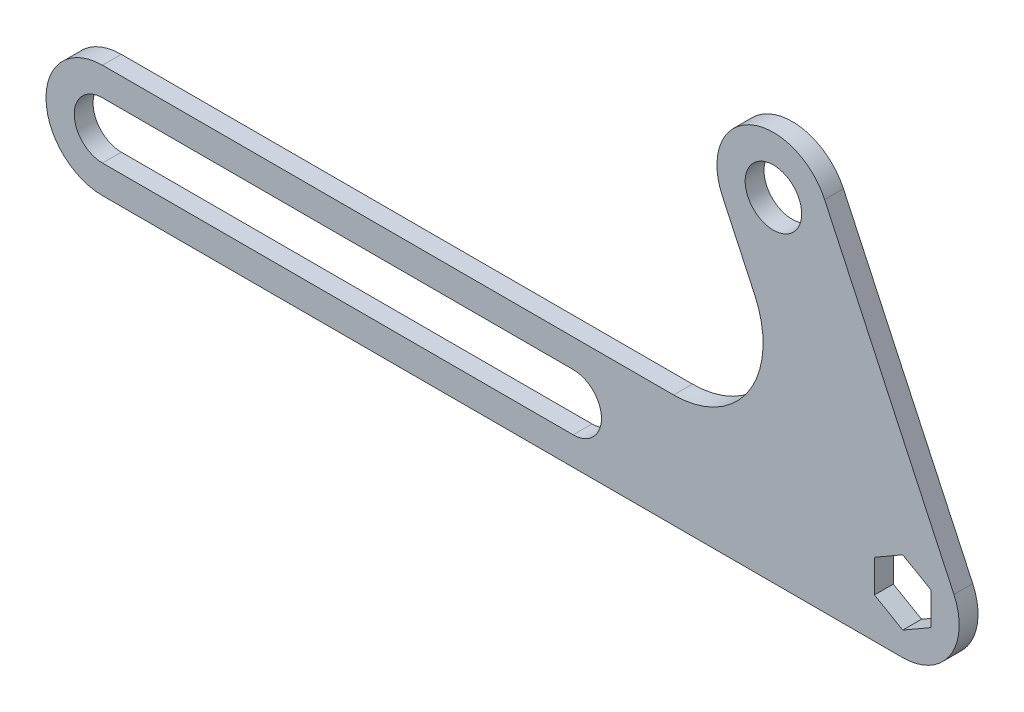
ISO-10303-21;
HEADER;
FILE_DESCRIPTION(('STEP AP214'),'2;1');
FILE_NAME('part.step','',(''),(''),'','','');
FILE_SCHEMA(('AUTOMOTIVE_DESIGN { 1 0 10303 214 1 1 1 1 }'));
ENDSEC;
DATA;
#1=APPLICATION_CONTEXT('core data for automotive mechanical design processes');
#2=APPLICATION_PROTOCOL_DEFINITION('international standard','automotive_design',2000,#1);
#3=PRODUCT_CONTEXT('',#1,'mechanical');
#4=PRODUCT('Part','Part','',(#3));
#5=PRODUCT_RELATED_PRODUCT_CATEGORY('part','',(#4));
#6=PRODUCT_DEFINITION_FORMATION('','',#4);
#7=PRODUCT_DEFINITION_CONTEXT('part definition',#1,'design');
#8=PRODUCT_DEFINITION('design','',#6,#7);
#9=PRODUCT_DEFINITION_SHAPE('','',#8);
#10=(LENGTH_UNIT() NAMED_UNIT(*) SI_UNIT(.MILLI.,.METRE.));
#11=(NAMED_UNIT(*) PLANE_ANGLE_UNIT() SI_UNIT($,.RADIAN.));
#12=(NAMED_UNIT(*) SI_UNIT($,.STERADIAN.) SOLID_ANGLE_UNIT());
#13=UNCERTAINTY_MEASURE_WITH_UNIT(LENGTH_MEASURE(1.E-05),#10,'distance_accuracy_value','');
#14=(GEOMETRIC_REPRESENTATION_CONTEXT(3) GLOBAL_UNCERTAINTY_ASSIGNED_CONTEXT((#13)) GLOBAL_UNIT_ASSIGNED_CONTEXT((#10,
#11,#12)) REPRESENTATION_CONTEXT('',''));
#15=CARTESIAN_POINT('',(0.,0.,0.));
#16=DIRECTION('',(0.,0.,1.));
#17=DIRECTION('',(1.,0.,0.));
#18=AXIS2_PLACEMENT_3D('',#15,#16,#17);
#19=CARTESIAN_POINT('',(0.,12.,4.));
#20=DIRECTION('',(0.,0.,1.));
#21=DIRECTION('',(1.,0.,0.));
#22=AXIS2_PLACEMENT_3D('',#19,#20,#21);
#23=PLANE('',#22);
#24=DIRECTION('',(1.,0.,0.));
#25=VECTOR('',#24,1.);
#26=CARTESIAN_POINT('',(0.,6.,4.));
#27=LINE('',#26,#25);
#28=CARTESIAN_POINT('',(0.,6.,4.));
#29=VERTEX_POINT('',#28);
#30=CARTESIAN_POINT('',(100.,6.,4.));
#31=VERTEX_POINT('',#30);
#32=EDGE_CURVE('E245',#29,#31,#27,.T.);
#33=ORIENTED_EDGE('',*,*,#32,.F.);
#34=CARTESIAN_POINT('',(0.,12.,4.));
#35=DIRECTION('',(0.,0.,1.));
#36=DIRECTION('',(1.,0.,0.));
#37=AXIS2_PLACEMENT_3D('',#34,#35,#36);
#38=CIRCLE('',#37,6.);
#39=CARTESIAN_POINT('',(0.,18.,4.));
#40=VERTEX_POINT('',#39);
#41=EDGE_CURVE('E242',#40,#29,#38,.T.);
#42=ORIENTED_EDGE('',*,*,#41,.F.);
#43=DIRECTION('',(-1.,0.,0.));
#44=VECTOR('',#43,1.);
#45=CARTESIAN_POINT('',(0.,18.,4.));
#46=LINE('',#45,#44);
#47=CARTESIAN_POINT('',(100.,18.,4.));
#48=VERTEX_POINT('',#47);
#49=EDGE_CURVE('E253',#48,#40,#46,.T.);
#50=ORIENTED_EDGE('',*,*,#49,.F.);
#51=CARTESIAN_POINT('',(100.,12.,4.));
#52=DIRECTION('',(0.,0.,1.));
#53=DIRECTION('',(1.,0.,0.));
#54=AXIS2_PLACEMENT_3D('',#51,#52,#53);
#55=CIRCLE('',#54,6.);
#56=EDGE_CURVE('E249',#31,#48,#55,.T.);
#57=ORIENTED_EDGE('',*,*,#56,.F.);
#58=EDGE_LOOP('',(#33,#42,#50,#57));
#59=FACE_BOUND('',#58,.T.);
#60=CARTESIAN_POINT('',(0.,12.,4.));
#61=DIRECTION('',(0.,0.,1.));
#62=DIRECTION('',(1.,0.,0.));
#63=AXIS2_PLACEMENT_3D('',#60,#61,#62);
#64=CIRCLE('',#63,12.);
#65=CARTESIAN_POINT('',(0.,24.,4.));
#66=VERTEX_POINT('',#65);
#67=CARTESIAN_POINT('',(0.,0.,4.));
#68=VERTEX_POINT('',#67);
#69=EDGE_CURVE('E285',#66,#68,#64,.T.);
#70=ORIENTED_EDGE('',*,*,#69,.T.);
#71=DIRECTION('',(1.,0.,0.));
#72=VECTOR('',#71,1.);
#73=CARTESIAN_POINT('',(0.,0.,4.));
#74=LINE('',#73,#72);
#75=CARTESIAN_POINT('',(170.,0.,4.));
#76=VERTEX_POINT('',#75);
#77=EDGE_CURVE('E289',#68,#76,#74,.T.);
#78=ORIENTED_EDGE('',*,*,#77,.T.);
#79=CARTESIAN_POINT('',(170.,12.,4.));
#80=DIRECTION('',(0.,0.,1.));
#81=DIRECTION('',(1.,0.,0.));
#82=AXIS2_PLACEMENT_3D('',#79,#80,#81);
#83=CIRCLE('',#82,12.);
#84=CARTESIAN_POINT('',(180.87569344444,17.0714191408884,4.));
#85=VERTEX_POINT('',#84);
#86=EDGE_CURVE('E293',#76,#85,#83,.T.);
#87=ORIENTED_EDGE('',*,*,#86,.T.);
#88=DIRECTION('',(-0.422618261740704,0.906307787036648,0.));
#89=VECTOR('',#88,1.);
#90=CARTESIAN_POINT('',(180.87569344444,17.0714191408884,4.));
#91=LINE('',#90,#89);
#92=CARTESIAN_POINT('',(153.405506431294,75.9814252982705,4.));
#93=VERTEX_POINT('',#92);
#94=EDGE_CURVE('E296',#85,#93,#91,.T.);
#95=ORIENTED_EDGE('',*,*,#94,.T.);
#96=CARTESIAN_POINT('',(142.529812986854,70.9100061573821,4.));
#97=DIRECTION('',(0.,0.,1.));
#98=DIRECTION('',(1.,0.,0.));
#99=AXIS2_PLACEMENT_3D('',#96,#97,#98);
#100=CIRCLE('',#99,12.);
#101=CARTESIAN_POINT('',(131.654119542414,65.8385870164936,4.));
#102=VERTEX_POINT('',#101);
#103=EDGE_CURVE('E299',#93,#102,#100,.T.);
#104=ORIENTED_EDGE('',*,*,#103,.T.);
#105=DIRECTION('',(0.422618261740704,-0.906307787036648,0.));
#106=VECTOR('',#105,1.);
#107=CARTESIAN_POINT('',(131.654119542414,65.8385870164936,4.));
#108=LINE('',#107,#106);
#109=CARTESIAN_POINT('',(138.559595063054,51.0297469730734,4.));
#110=VERTEX_POINT('',#109);
#111=EDGE_CURVE('E302',#102,#110,#108,.T.);
#112=ORIENTED_EDGE('',*,*,#111,.T.);
#113=CARTESIAN_POINT('',(121.339747109357,43.,4.));
#114=DIRECTION('',(0.,0.,-1.));
#115=DIRECTION('',(-1.,0.,0.));
#116=AXIS2_PLACEMENT_3D('',#113,#114,#115);
#117=CIRCLE('',#116,19.);
#118=CARTESIAN_POINT('',(121.339747109357,24.,4.));
#119=VERTEX_POINT('',#118);
#120=EDGE_CURVE('E305',#110,#119,#117,.T.);
#121=ORIENTED_EDGE('',*,*,#120,.T.);
#122=DIRECTION('',(-1.,0.,0.));
#123=VECTOR('',#122,1.);
#124=CARTESIAN_POINT('',(121.339747109357,24.,4.));
#125=LINE('',#124,#123);
#126=EDGE_CURVE('E308',#119,#66,#125,.T.);
#127=ORIENTED_EDGE('',*,*,#126,.T.);
#128=EDGE_LOOP('',(#70,#78,#87,#95,#104,#112,#121,#127));
#129=FACE_BOUND('',#128,.T.);
#130=CARTESIAN_POINT('',(142.529812986854,70.9100061573821,4.));
#131=DIRECTION('',(0.,0.,1.));
#132=DIRECTION('',(1.,0.,0.));
#133=AXIS2_PLACEMENT_3D('',#130,#131,#132);
#134=CIRCLE('',#133,6.00000000000002);
#135=CARTESIAN_POINT('',(148.529812986854,70.9100061573821,4.));
#136=VERTEX_POINT('',#135);
#137=EDGE_CURVE('E234',#136,#136,#134,.T.);
#138=ORIENTED_EDGE('',*,*,#137,.F.);
#139=EDGE_LOOP('',(#138));
#140=FACE_BOUND('',#139,.T.);
#141=DIRECTION('',(-0.866025403784437,-0.500000000000002,0.));
#142=VECTOR('',#141,1.);
#143=CARTESIAN_POINT('',(170.,18.9282032302755,4.));
#144=LINE('',#143,#142);
#145=CARTESIAN_POINT('',(170.,18.9282032302755,4.));
#146=VERTEX_POINT('',#145);
#147=CARTESIAN_POINT('',(164.,15.4641016151377,4.));
#148=VERTEX_POINT('',#147);
#149=EDGE_CURVE('E174',#146,#148,#144,.T.);
#150=ORIENTED_EDGE('',*,*,#149,.F.);
#151=DIRECTION('',(-0.866025403784439,0.499999999999999,0.));
#152=VECTOR('',#151,1.);
#153=CARTESIAN_POINT('',(176.,15.4641016151377,4.));
#154=LINE('',#153,#152);
#155=CARTESIAN_POINT('',(176.,15.4641016151377,4.));
#156=VERTEX_POINT('',#155);
#157=EDGE_CURVE('E165',#156,#146,#154,.T.);
#158=ORIENTED_EDGE('',*,*,#157,.F.);
#159=DIRECTION('',(0.,1.,0.));
#160=VECTOR('',#159,1.);
#161=CARTESIAN_POINT('',(176.,8.53589838486226,4.));
#162=LINE('',#161,#160);
#163=CARTESIAN_POINT('',(176.,8.53589838486226,4.));
#164=VERTEX_POINT('',#163);
#165=EDGE_CURVE('E200',#164,#156,#162,.T.);
#166=ORIENTED_EDGE('',*,*,#165,.F.);
#167=DIRECTION('',(0.866025403784439,0.499999999999999,0.));
#168=VECTOR('',#167,1.);
#169=CARTESIAN_POINT('',(170.,5.07179676972451,4.));
#170=LINE('',#169,#168);
#171=CARTESIAN_POINT('',(170.,5.07179676972451,4.));
#172=VERTEX_POINT('',#171);
#173=EDGE_CURVE('E197',#172,#164,#170,.T.);
#174=ORIENTED_EDGE('',*,*,#173,.F.);
#175=DIRECTION('',(0.866025403784438,-0.500000000000001,0.));
#176=VECTOR('',#175,1.);
#177=CARTESIAN_POINT('',(164.,8.53589838486224,4.));
#178=LINE('',#177,#176);
#179=CARTESIAN_POINT('',(164.,8.53589838486224,4.));
#180=VERTEX_POINT('',#179);
#181=EDGE_CURVE('E192',#180,#172,#178,.T.);
#182=ORIENTED_EDGE('',*,*,#181,.F.);
#183=DIRECTION('',(0.,-1.,0.));
#184=VECTOR('',#183,1.);
#185=CARTESIAN_POINT('',(164.,15.4641016151377,4.));
#186=LINE('',#185,#184);
#187=EDGE_CURVE('E188',#148,#180,#186,.T.);
#188=ORIENTED_EDGE('',*,*,#187,.F.);
#189=EDGE_LOOP('',(#150,#158,#166,#174,#182,#188));
#190=FACE_BOUND('',#189,.T.);
#191=ADVANCED_FACE('F39',(#59,#129,#140,#190),#23,.T.);
#192=CARTESIAN_POINT('',(0.,12.,0.));
#193=DIRECTION('',(0.,0.,1.));
#194=DIRECTION('',(1.,0.,0.));
#195=AXIS2_PLACEMENT_3D('',#192,#193,#194);
#196=PLANE('',#195);
#197=CARTESIAN_POINT('',(142.529812986854,70.9100061573821,0.));
#198=DIRECTION('',(0.,0.,1.));
#199=DIRECTION('',(1.,0.,0.));
#200=AXIS2_PLACEMENT_3D('',#197,#198,#199);
#201=CIRCLE('',#200,6.00000000000002);
#202=CARTESIAN_POINT('',(148.529812986854,70.9100061573821,0.));
#203=VERTEX_POINT('',#202);
#204=EDGE_CURVE('E183',#203,#203,#201,.T.);
#205=ORIENTED_EDGE('',*,*,#204,.T.);
#206=EDGE_LOOP('',(#205));
#207=FACE_BOUND('',#206,.T.);
#208=CARTESIAN_POINT('',(0.,12.,0.));
#209=DIRECTION('',(0.,0.,1.));
#210=DIRECTION('',(1.,0.,0.));
#211=AXIS2_PLACEMENT_3D('',#208,#209,#210);
#212=CIRCLE('',#211,6.);
#213=CARTESIAN_POINT('',(0.,18.,0.));
#214=VERTEX_POINT('',#213);
#215=CARTESIAN_POINT('',(0.,6.,0.));
#216=VERTEX_POINT('',#215);
#217=EDGE_CURVE('E238',#214,#216,#212,.T.);
#218=ORIENTED_EDGE('',*,*,#217,.T.);
#219=DIRECTION('',(1.,0.,0.));
#220=VECTOR('',#219,1.);
#221=CARTESIAN_POINT('',(0.,6.,0.));
#222=LINE('',#221,#220);
#223=CARTESIAN_POINT('',(100.,6.,0.));
#224=VERTEX_POINT('',#223);
#225=EDGE_CURVE('E260',#216,#224,#222,.T.);
#226=ORIENTED_EDGE('',*,*,#225,.T.);
#227=CARTESIAN_POINT('',(100.,12.,0.));
#228=DIRECTION('',(0.,0.,1.));
#229=DIRECTION('',(1.,0.,0.));
#230=AXIS2_PLACEMENT_3D('',#227,#228,#229);
#231=CIRCLE('',#230,6.);
#232=CARTESIAN_POINT('',(100.,18.,0.));
#233=VERTEX_POINT('',#232);
#234=EDGE_CURVE('E264',#224,#233,#231,.T.);
#235=ORIENTED_EDGE('',*,*,#234,.T.);
#236=DIRECTION('',(-1.,0.,0.));
#237=VECTOR('',#236,1.);
#238=CARTESIAN_POINT('',(0.,18.,0.));
#239=LINE('',#238,#237);
#240=EDGE_CURVE('E246',#233,#214,#239,.T.);
#241=ORIENTED_EDGE('',*,*,#240,.T.);
#242=EDGE_LOOP('',(#218,#226,#235,#241));
#243=FACE_BOUND('',#242,.T.);
#244=CARTESIAN_POINT('',(0.,12.,0.));
#245=DIRECTION('',(0.,0.,1.));
#246=DIRECTION('',(1.,0.,0.));
#247=AXIS2_PLACEMENT_3D('',#244,#245,#246);
#248=CIRCLE('',#247,12.);
#249=CARTESIAN_POINT('',(0.,24.,0.));
#250=VERTEX_POINT('',#249);
#251=CARTESIAN_POINT('',(0.,0.,0.));
#252=VERTEX_POINT('',#251);
#253=EDGE_CURVE('E284',#250,#252,#248,.T.);
#254=ORIENTED_EDGE('',*,*,#253,.F.);
#255=DIRECTION('',(-1.,0.,0.));
#256=VECTOR('',#255,1.);
#257=CARTESIAN_POINT('',(121.339747109357,24.,0.));
#258=LINE('',#257,#256);
#259=CARTESIAN_POINT('',(121.339747109357,24.,0.));
#260=VERTEX_POINT('',#259);
#261=EDGE_CURVE('E290',#260,#250,#258,.T.);
#262=ORIENTED_EDGE('',*,*,#261,.F.);
#263=CARTESIAN_POINT('',(121.339747109357,43.,0.));
#264=DIRECTION('',(0.,0.,-1.));
#265=DIRECTION('',(-1.,0.,0.));
#266=AXIS2_PLACEMENT_3D('',#263,#264,#265);
#267=CIRCLE('',#266,19.);
#268=CARTESIAN_POINT('',(138.559595063054,51.0297469730734,0.));
#269=VERTEX_POINT('',#268);
#270=EDGE_CURVE('E330',#269,#260,#267,.T.);
#271=ORIENTED_EDGE('',*,*,#270,.F.);
#272=DIRECTION('',(0.422618261740704,-0.906307787036648,0.));
#273=VECTOR('',#272,1.);
#274=CARTESIAN_POINT('',(131.654119542414,65.8385870164936,0.));
#275=LINE('',#274,#273);
#276=CARTESIAN_POINT('',(131.654119542414,65.8385870164936,0.));
#277=VERTEX_POINT('',#276);
#278=EDGE_CURVE('E327',#277,#269,#275,.T.);
#279=ORIENTED_EDGE('',*,*,#278,.F.);
#280=CARTESIAN_POINT('',(142.529812986854,70.9100061573821,0.));
#281=DIRECTION('',(0.,0.,1.));
#282=DIRECTION('',(1.,0.,0.));
#283=AXIS2_PLACEMENT_3D('',#280,#281,#282);
#284=CIRCLE('',#283,12.);
#285=CARTESIAN_POINT('',(153.405506431294,75.9814252982705,0.));
#286=VERTEX_POINT('',#285);
#287=EDGE_CURVE('E324',#286,#277,#284,.T.);
#288=ORIENTED_EDGE('',*,*,#287,.F.);
#289=DIRECTION('',(-0.422618261740704,0.906307787036648,0.));
#290=VECTOR('',#289,1.);
#291=CARTESIAN_POINT('',(180.87569344444,17.0714191408884,0.));
#292=LINE('',#291,#290);
#293=CARTESIAN_POINT('',(180.87569344444,17.0714191408884,0.));
#294=VERTEX_POINT('',#293);
#295=EDGE_CURVE('E321',#294,#286,#292,.T.);
#296=ORIENTED_EDGE('',*,*,#295,.F.);
#297=CARTESIAN_POINT('',(170.,12.,0.));
#298=DIRECTION('',(0.,0.,1.));
#299=DIRECTION('',(1.,0.,0.));
#300=AXIS2_PLACEMENT_3D('',#297,#298,#299);
#301=CIRCLE('',#300,12.);
#302=CARTESIAN_POINT('',(170.,0.,0.));
#303=VERTEX_POINT('',#302);
#304=EDGE_CURVE('E318',#303,#294,#301,.T.);
#305=ORIENTED_EDGE('',*,*,#304,.F.);
#306=DIRECTION('',(1.,0.,0.));
#307=VECTOR('',#306,1.);
#308=CARTESIAN_POINT('',(0.,0.,0.));
#309=LINE('',#308,#307);
#310=EDGE_CURVE('E315',#252,#303,#309,.T.);
#311=ORIENTED_EDGE('',*,*,#310,.F.);
#312=EDGE_LOOP('',(#254,#262,#271,#279,#288,#296,#305,#311));
#313=FACE_BOUND('',#312,.T.);
#314=DIRECTION('',(-0.866025403784439,0.499999999999999,0.));
#315=VECTOR('',#314,1.);
#316=CARTESIAN_POINT('',(176.,15.4641016151377,0.));
#317=LINE('',#316,#315);
#318=CARTESIAN_POINT('',(176.,15.4641016151377,0.));
#319=VERTEX_POINT('',#318);
#320=CARTESIAN_POINT('',(170.,18.9282032302755,0.));
#321=VERTEX_POINT('',#320);
#322=EDGE_CURVE('E63',#319,#321,#317,.T.);
#323=ORIENTED_EDGE('',*,*,#322,.T.);
#324=DIRECTION('',(-0.866025403784437,-0.500000000000002,0.));
#325=VECTOR('',#324,1.);
#326=CARTESIAN_POINT('',(170.,18.9282032302755,0.));
#327=LINE('',#326,#325);
#328=CARTESIAN_POINT('',(164.,15.4641016151377,0.));
#329=VERTEX_POINT('',#328);
#330=EDGE_CURVE('E181',#321,#329,#327,.T.);
#331=ORIENTED_EDGE('',*,*,#330,.T.);
#332=DIRECTION('',(0.,-1.,0.));
#333=VECTOR('',#332,1.);
#334=CARTESIAN_POINT('',(164.,15.4641016151377,0.));
#335=LINE('',#334,#333);
#336=CARTESIAN_POINT('',(164.,8.53589838486224,0.));
#337=VERTEX_POINT('',#336);
#338=EDGE_CURVE('E207',#329,#337,#335,.T.);
#339=ORIENTED_EDGE('',*,*,#338,.T.);
#340=DIRECTION('',(0.866025403784438,-0.500000000000001,0.));
#341=VECTOR('',#340,1.);
#342=CARTESIAN_POINT('',(164.,8.53589838486224,0.));
#343=LINE('',#342,#341);
#344=CARTESIAN_POINT('',(170.,5.07179676972451,0.));
#345=VERTEX_POINT('',#344);
#346=EDGE_CURVE('E211',#337,#345,#343,.T.);
#347=ORIENTED_EDGE('',*,*,#346,.T.);
#348=DIRECTION('',(0.866025403784439,0.499999999999999,0.));
#349=VECTOR('',#348,1.);
#350=CARTESIAN_POINT('',(170.,5.07179676972451,0.));
#351=LINE('',#350,#349);
#352=CARTESIAN_POINT('',(176.,8.53589838486226,0.));
#353=VERTEX_POINT('',#352);
#354=EDGE_CURVE('E215',#345,#353,#351,.T.);
#355=ORIENTED_EDGE('',*,*,#354,.T.);
#356=DIRECTION('',(0.,1.,0.));
#357=VECTOR('',#356,1.);
#358=CARTESIAN_POINT('',(176.,8.53589838486226,0.));
#359=LINE('',#358,#357);
#360=EDGE_CURVE('E175',#353,#319,#359,.T.);
#361=ORIENTED_EDGE('',*,*,#360,.T.);
#362=EDGE_LOOP('',(#323,#331,#339,#347,#355,#361));
#363=FACE_BOUND('',#362,.T.);
#364=ADVANCED_FACE('F369',(#207,#243,#313,#363),#196,.F.);
#365=CARTESIAN_POINT('',(0.,12.,4.));
#366=DIRECTION('',(0.,0.,-1.));
#367=DIRECTION('',(-1.,0.,0.));
#368=AXIS2_PLACEMENT_3D('',#365,#366,#367);
#369=CYLINDRICAL_SURFACE('',#368,12.);
#370=ORIENTED_EDGE('',*,*,#253,.T.);
#371=DIRECTION('',(0.,0.,-1.));
#372=VECTOR('',#371,1.);
#373=CARTESIAN_POINT('',(0.,0.,4.));
#374=LINE('',#373,#372);
#375=EDGE_CURVE('E11',#68,#252,#374,.T.);
#376=ORIENTED_EDGE('',*,*,#375,.F.);
#377=ORIENTED_EDGE('',*,*,#69,.F.);
#378=DIRECTION('',(0.,0.,-1.));
#379=VECTOR('',#378,1.);
#380=CARTESIAN_POINT('',(0.,24.,4.));
#381=LINE('',#380,#379);
#382=EDGE_CURVE('E311',#66,#250,#381,.T.);
#383=ORIENTED_EDGE('',*,*,#382,.T.);
#384=EDGE_LOOP('',(#370,#376,#377,#383));
#385=FACE_BOUND('',#384,.T.);
#386=ADVANCED_FACE('F41',(#385),#369,.T.);
#387=CARTESIAN_POINT('',(0.,0.,4.));
#388=DIRECTION('',(0.,1.,0.));
#389=DIRECTION('',(0.,0.,1.));
#390=AXIS2_PLACEMENT_3D('',#387,#388,#389);
#391=PLANE('',#390);
#392=ORIENTED_EDGE('',*,*,#310,.T.);
#393=DIRECTION('',(0.,0.,-1.));
#394=VECTOR('',#393,1.);
#395=CARTESIAN_POINT('',(170.,0.,4.));
#396=LINE('',#395,#394);
#397=EDGE_CURVE('E48',#76,#303,#396,.T.);
#398=ORIENTED_EDGE('',*,*,#397,.F.);
#399=ORIENTED_EDGE('',*,*,#77,.F.);
#400=ORIENTED_EDGE('',*,*,#375,.T.);
#401=EDGE_LOOP('',(#392,#398,#399,#400));
#402=FACE_BOUND('',#401,.T.);
#403=ADVANCED_FACE('F387',(#402),#391,.F.);
#404=CARTESIAN_POINT('',(170.,12.,4.));
#405=DIRECTION('',(0.,0.,-1.));
#406=DIRECTION('',(-1.,0.,0.));
#407=AXIS2_PLACEMENT_3D('',#404,#405,#406);
#408=CYLINDRICAL_SURFACE('',#407,12.);
#409=ORIENTED_EDGE('',*,*,#304,.T.);
#410=DIRECTION('',(0.,0.,-1.));
#411=VECTOR('',#410,1.);
#412=CARTESIAN_POINT('',(180.87569344444,17.0714191408884,4.));
#413=LINE('',#412,#411);
#414=EDGE_CURVE('E354',#85,#294,#413,.T.);
#415=ORIENTED_EDGE('',*,*,#414,.F.);
#416=ORIENTED_EDGE('',*,*,#86,.F.);
#417=ORIENTED_EDGE('',*,*,#397,.T.);
#418=EDGE_LOOP('',(#409,#415,#416,#417));
#419=FACE_BOUND('',#418,.T.);
#420=ADVANCED_FACE('F363',(#419),#408,.T.);
#421=CARTESIAN_POINT('',(180.87569344444,17.0714191408884,4.));
#422=DIRECTION('',(-0.906307787036648,-0.422618261740704,0.));
#423=DIRECTION('',(0.422618261740704,-0.906307787036648,0.));
#424=AXIS2_PLACEMENT_3D('',#421,#422,#423);
#425=PLANE('',#424);
#426=ORIENTED_EDGE('',*,*,#295,.T.);
#427=DIRECTION('',(0.,0.,-1.));
#428=VECTOR('',#427,1.);
#429=CARTESIAN_POINT('',(153.405506431294,75.9814252982705,4.));
#430=LINE('',#429,#428);
#431=EDGE_CURVE('E350',#93,#286,#430,.T.);
#432=ORIENTED_EDGE('',*,*,#431,.F.);
#433=ORIENTED_EDGE('',*,*,#94,.F.);
#434=ORIENTED_EDGE('',*,*,#414,.T.);
#435=EDGE_LOOP('',(#426,#432,#433,#434));
#436=FACE_BOUND('',#435,.T.);
#437=ADVANCED_FACE('F375',(#436),#425,.F.);
#438=CARTESIAN_POINT('',(142.529812986854,70.9100061573821,4.));
#439=DIRECTION('',(0.,0.,-1.));
#440=DIRECTION('',(-1.,0.,0.));
#441=AXIS2_PLACEMENT_3D('',#438,#439,#440);
#442=CYLINDRICAL_SURFACE('',#441,12.);
#443=ORIENTED_EDGE('',*,*,#287,.T.);
#444=DIRECTION('',(0.,0.,-1.));
#445=VECTOR('',#444,1.);
#446=CARTESIAN_POINT('',(131.654119542414,65.8385870164936,4.));
#447=LINE('',#446,#445);
#448=EDGE_CURVE('E346',#102,#277,#447,.T.);
#449=ORIENTED_EDGE('',*,*,#448,.F.);
#450=ORIENTED_EDGE('',*,*,#103,.F.);
#451=ORIENTED_EDGE('',*,*,#431,.T.);
#452=EDGE_LOOP('',(#443,#449,#450,#451));
#453=FACE_BOUND('',#452,.T.);
#454=ADVANCED_FACE('F379',(#453),#442,.T.);
#455=CARTESIAN_POINT('',(131.654119542414,65.8385870164936,4.));
#456=DIRECTION('',(0.906307787036648,0.422618261740704,0.));
#457=DIRECTION('',(-0.422618261740704,0.906307787036648,0.));
#458=AXIS2_PLACEMENT_3D('',#455,#456,#457);
#459=PLANE('',#458);
#460=ORIENTED_EDGE('',*,*,#278,.T.);
#461=DIRECTION('',(0.,0.,-1.));
#462=VECTOR('',#461,1.);
#463=CARTESIAN_POINT('',(138.559595063054,51.0297469730734,4.));
#464=LINE('',#463,#462);
#465=EDGE_CURVE('E342',#110,#269,#464,.T.);
#466=ORIENTED_EDGE('',*,*,#465,.F.);
#467=ORIENTED_EDGE('',*,*,#111,.F.);
#468=ORIENTED_EDGE('',*,*,#448,.T.);
#469=EDGE_LOOP('',(#460,#466,#467,#468));
#470=FACE_BOUND('',#469,.T.);
#471=ADVANCED_FACE('F400',(#470),#459,.F.);
#472=CARTESIAN_POINT('',(121.339747109357,43.,4.));
#473=DIRECTION('',(0.,0.,-1.));
#474=DIRECTION('',(-1.,0.,0.));
#475=AXIS2_PLACEMENT_3D('',#472,#473,#474);
#476=CYLINDRICAL_SURFACE('',#475,19.);
#477=ORIENTED_EDGE('',*,*,#270,.T.);
#478=DIRECTION('',(0.,0.,-1.));
#479=VECTOR('',#478,1.);
#480=CARTESIAN_POINT('',(121.339747109357,24.,4.));
#481=LINE('',#480,#479);
#482=EDGE_CURVE('E338',#119,#260,#481,.T.);
#483=ORIENTED_EDGE('',*,*,#482,.F.);
#484=ORIENTED_EDGE('',*,*,#120,.F.);
#485=ORIENTED_EDGE('',*,*,#465,.T.);
#486=EDGE_LOOP('',(#477,#483,#484,#485));
#487=FACE_BOUND('',#486,.T.);
#488=ADVANCED_FACE('F398',(#487),#476,.F.);
#489=CARTESIAN_POINT('',(121.339747109357,24.,4.));
#490=DIRECTION('',(0.,-1.,0.));
#491=DIRECTION('',(1.,0.,0.));
#492=AXIS2_PLACEMENT_3D('',#489,#490,#491);
#493=PLANE('',#492);
#494=ORIENTED_EDGE('',*,*,#261,.T.);
#495=ORIENTED_EDGE('',*,*,#382,.F.);
#496=ORIENTED_EDGE('',*,*,#126,.F.);
#497=ORIENTED_EDGE('',*,*,#482,.T.);
#498=EDGE_LOOP('',(#494,#495,#496,#497));
#499=FACE_BOUND('',#498,.T.);
#500=ADVANCED_FACE('F393',(#499),#493,.F.);
#501=CARTESIAN_POINT('',(0.,12.,4.));
#502=DIRECTION('',(0.,0.,-1.));
#503=DIRECTION('',(-1.,0.,0.));
#504=AXIS2_PLACEMENT_3D('',#501,#502,#503);
#505=CYLINDRICAL_SURFACE('',#504,6.);
#506=ORIENTED_EDGE('',*,*,#217,.F.);
#507=DIRECTION('',(0.,0.,-1.));
#508=VECTOR('',#507,1.);
#509=CARTESIAN_POINT('',(0.,18.,4.));
#510=LINE('',#509,#508);
#511=EDGE_CURVE('E256',#40,#214,#510,.T.);
#512=ORIENTED_EDGE('',*,*,#511,.F.);
#513=ORIENTED_EDGE('',*,*,#41,.T.);
#514=DIRECTION('',(0.,0.,-1.));
#515=VECTOR('',#514,1.);
#516=CARTESIAN_POINT('',(0.,6.,4.));
#517=LINE('',#516,#515);
#518=EDGE_CURVE('E280',#29,#216,#517,.T.);
#519=ORIENTED_EDGE('',*,*,#518,.T.);
#520=EDGE_LOOP('',(#506,#512,#513,#519));
#521=FACE_BOUND('',#520,.T.);
#522=ADVANCED_FACE('F419',(#521),#505,.F.);
#523=CARTESIAN_POINT('',(0.,6.,4.));
#524=DIRECTION('',(0.,1.,0.));
#525=DIRECTION('',(0.,0.,1.));
#526=AXIS2_PLACEMENT_3D('',#523,#524,#525);
#527=PLANE('',#526);
#528=ORIENTED_EDGE('',*,*,#225,.F.);
#529=ORIENTED_EDGE('',*,*,#518,.F.);
#530=ORIENTED_EDGE('',*,*,#32,.T.);
#531=DIRECTION('',(0.,0.,-1.));
#532=VECTOR('',#531,1.);
#533=CARTESIAN_POINT('',(100.,6.,4.));
#534=LINE('',#533,#532);
#535=EDGE_CURVE('E277',#31,#224,#534,.T.);
#536=ORIENTED_EDGE('',*,*,#535,.T.);
#537=EDGE_LOOP('',(#528,#529,#530,#536));
#538=FACE_BOUND('',#537,.T.);
#539=ADVANCED_FACE('F426',(#538),#527,.T.);
#540=CARTESIAN_POINT('',(100.,12.,4.));
#541=DIRECTION('',(0.,0.,-1.));
#542=DIRECTION('',(-1.,0.,0.));
#543=AXIS2_PLACEMENT_3D('',#540,#541,#542);
#544=CYLINDRICAL_SURFACE('',#543,6.);
#545=ORIENTED_EDGE('',*,*,#234,.F.);
#546=ORIENTED_EDGE('',*,*,#535,.F.);
#547=ORIENTED_EDGE('',*,*,#56,.T.);
#548=DIRECTION('',(0.,0.,-1.));
#549=VECTOR('',#548,1.);
#550=CARTESIAN_POINT('',(100.,18.,4.));
#551=LINE('',#550,#549);
#552=EDGE_CURVE('E274',#48,#233,#551,.T.);
#553=ORIENTED_EDGE('',*,*,#552,.T.);
#554=EDGE_LOOP('',(#545,#546,#547,#553));
#555=FACE_BOUND('',#554,.T.);
#556=ADVANCED_FACE('F431',(#555),#544,.F.);
#557=CARTESIAN_POINT('',(0.,18.,4.));
#558=DIRECTION('',(0.,-1.,0.));
#559=DIRECTION('',(0.,0.,-1.));
#560=AXIS2_PLACEMENT_3D('',#557,#558,#559);
#561=PLANE('',#560);
#562=ORIENTED_EDGE('',*,*,#240,.F.);
#563=ORIENTED_EDGE('',*,*,#552,.F.);
#564=ORIENTED_EDGE('',*,*,#49,.T.);
#565=ORIENTED_EDGE('',*,*,#511,.T.);
#566=EDGE_LOOP('',(#562,#563,#564,#565));
#567=FACE_BOUND('',#566,.T.);
#568=ADVANCED_FACE('F439',(#567),#561,.T.);
#569=CARTESIAN_POINT('',(142.529812986854,70.9100061573821,4.));
#570=DIRECTION('',(0.,0.,-1.));
#571=DIRECTION('',(-1.,0.,0.));
#572=AXIS2_PLACEMENT_3D('',#569,#570,#571);
#573=CYLINDRICAL_SURFACE('',#572,6.00000000000002);
#574=ORIENTED_EDGE('',*,*,#137,.T.);
#575=EDGE_LOOP('',(#574));
#576=FACE_BOUND('',#575,.T.);
#577=ORIENTED_EDGE('',*,*,#204,.F.);
#578=EDGE_LOOP('',(#577));
#579=FACE_BOUND('',#578,.T.);
#580=ADVANCED_FACE('F450',(#576,#579),#573,.F.);
#581=CARTESIAN_POINT('',(176.,15.4641016151377,4.));
#582=DIRECTION('',(-0.499999999999999,-0.866025403784439,0.));
#583=DIRECTION('',(0.866025403784439,-0.499999999999999,0.));
#584=AXIS2_PLACEMENT_3D('',#581,#582,#583);
#585=PLANE('',#584);
#586=ORIENTED_EDGE('',*,*,#322,.F.);
#587=DIRECTION('',(0.,0.,-1.));
#588=VECTOR('',#587,1.);
#589=CARTESIAN_POINT('',(176.,15.4641016151377,4.));
#590=LINE('',#589,#588);
#591=EDGE_CURVE('E169',#156,#319,#590,.T.);
#592=ORIENTED_EDGE('',*,*,#591,.F.);
#593=ORIENTED_EDGE('',*,*,#157,.T.);
#594=DIRECTION('',(0.,0.,-1.));
#595=VECTOR('',#594,1.);
#596=CARTESIAN_POINT('',(170.,18.9282032302755,4.));
#597=LINE('',#596,#595);
#598=EDGE_CURVE('E168',#146,#321,#597,.T.);
#599=ORIENTED_EDGE('',*,*,#598,.T.);
#600=EDGE_LOOP('',(#586,#592,#593,#599));
#601=FACE_BOUND('',#600,.T.);
#602=ADVANCED_FACE('F167',(#601),#585,.T.);
#603=CARTESIAN_POINT('',(170.,18.9282032302755,4.));
#604=DIRECTION('',(0.500000000000002,-0.866025403784437,0.));
#605=DIRECTION('',(0.866025403784437,0.500000000000002,0.));
#606=AXIS2_PLACEMENT_3D('',#603,#604,#605);
#607=PLANE('',#606);
#608=ORIENTED_EDGE('',*,*,#330,.F.);
#609=ORIENTED_EDGE('',*,*,#598,.F.);
#610=ORIENTED_EDGE('',*,*,#149,.T.);
#611=DIRECTION('',(0.,0.,-1.));
#612=VECTOR('',#611,1.);
#613=CARTESIAN_POINT('',(164.,15.4641016151377,4.));
#614=LINE('',#613,#612);
#615=EDGE_CURVE('E184',#148,#329,#614,.T.);
#616=ORIENTED_EDGE('',*,*,#615,.T.);
#617=EDGE_LOOP('',(#608,#609,#610,#616));
#618=FACE_BOUND('',#617,.T.);
#619=ADVANCED_FACE('F178',(#618),#607,.T.);
#620=CARTESIAN_POINT('',(164.,15.4641016151377,4.));
#621=DIRECTION('',(1.,0.,0.));
#622=DIRECTION('',(0.,0.,-1.));
#623=AXIS2_PLACEMENT_3D('',#620,#621,#622);
#624=PLANE('',#623);
#625=ORIENTED_EDGE('',*,*,#338,.F.);
#626=ORIENTED_EDGE('',*,*,#615,.F.);
#627=ORIENTED_EDGE('',*,*,#187,.T.);
#628=DIRECTION('',(0.,0.,-1.));
#629=VECTOR('',#628,1.);
#630=CARTESIAN_POINT('',(164.,8.53589838486224,4.));
#631=LINE('',#630,#629);
#632=EDGE_CURVE('E229',#180,#337,#631,.T.);
#633=ORIENTED_EDGE('',*,*,#632,.T.);
#634=EDGE_LOOP('',(#625,#626,#627,#633));
#635=FACE_BOUND('',#634,.T.);
#636=ADVANCED_FACE('F460',(#635),#624,.T.);
#637=CARTESIAN_POINT('',(164.,8.53589838486224,4.));
#638=DIRECTION('',(0.500000000000001,0.866025403784438,0.));
#639=DIRECTION('',(-0.866025403784438,0.500000000000001,0.));
#640=AXIS2_PLACEMENT_3D('',#637,#638,#639);
#641=PLANE('',#640);
#642=ORIENTED_EDGE('',*,*,#346,.F.);
#643=ORIENTED_EDGE('',*,*,#632,.F.);
#644=ORIENTED_EDGE('',*,*,#181,.T.);
#645=DIRECTION('',(0.,0.,-1.));
#646=VECTOR('',#645,1.);
#647=CARTESIAN_POINT('',(170.,5.07179676972451,4.));
#648=LINE('',#647,#646);
#649=EDGE_CURVE('E226',#172,#345,#648,.T.);
#650=ORIENTED_EDGE('',*,*,#649,.T.);
#651=EDGE_LOOP('',(#642,#643,#644,#650));
#652=FACE_BOUND('',#651,.T.);
#653=ADVANCED_FACE('F463',(#652),#641,.T.);
#654=CARTESIAN_POINT('',(170.,5.07179676972451,4.));
#655=DIRECTION('',(-0.499999999999999,0.866025403784439,0.));
#656=DIRECTION('',(-0.866025403784439,-0.499999999999999,0.));
#657=AXIS2_PLACEMENT_3D('',#654,#655,#656);
#658=PLANE('',#657);
#659=ORIENTED_EDGE('',*,*,#354,.F.);
#660=ORIENTED_EDGE('',*,*,#649,.F.);
#661=ORIENTED_EDGE('',*,*,#173,.T.);
#662=DIRECTION('',(0.,0.,-1.));
#663=VECTOR('',#662,1.);
#664=CARTESIAN_POINT('',(176.,8.53589838486226,4.));
#665=LINE('',#664,#663);
#666=EDGE_CURVE('E55',#164,#353,#665,.T.);
#667=ORIENTED_EDGE('',*,*,#666,.T.);
#668=EDGE_LOOP('',(#659,#660,#661,#667));
#669=FACE_BOUND('',#668,.T.);
#670=ADVANCED_FACE('F467',(#669),#658,.T.);
#671=CARTESIAN_POINT('',(176.,8.53589838486226,4.));
#672=DIRECTION('',(-1.,0.,0.));
#673=DIRECTION('',(0.,0.,1.));
#674=AXIS2_PLACEMENT_3D('',#671,#672,#673);
#675=PLANE('',#674);
#676=ORIENTED_EDGE('',*,*,#360,.F.);
#677=ORIENTED_EDGE('',*,*,#666,.F.);
#678=ORIENTED_EDGE('',*,*,#165,.T.);
#679=ORIENTED_EDGE('',*,*,#591,.T.);
#680=EDGE_LOOP('',(#676,#677,#678,#679));
#681=FACE_BOUND('',#680,.T.);
#682=ADVANCED_FACE('F471',(#681),#675,.T.);
#683=CLOSED_SHELL('',(#191,#364,#386,#403,#420,#437,#454,#471,#488,#500,#522,#539,#556,#568,
#580,#602,#619,#636,#653,#670,#682));
#684=MANIFOLD_SOLID_BREP('B2',#683);
#685=ADVANCED_BREP_SHAPE_REPRESENTATION('',(#18,#684),#14);
#686=SHAPE_DEFINITION_REPRESENTATION(#9,#685);
ENDSEC;
END-ISO-10303-21;
